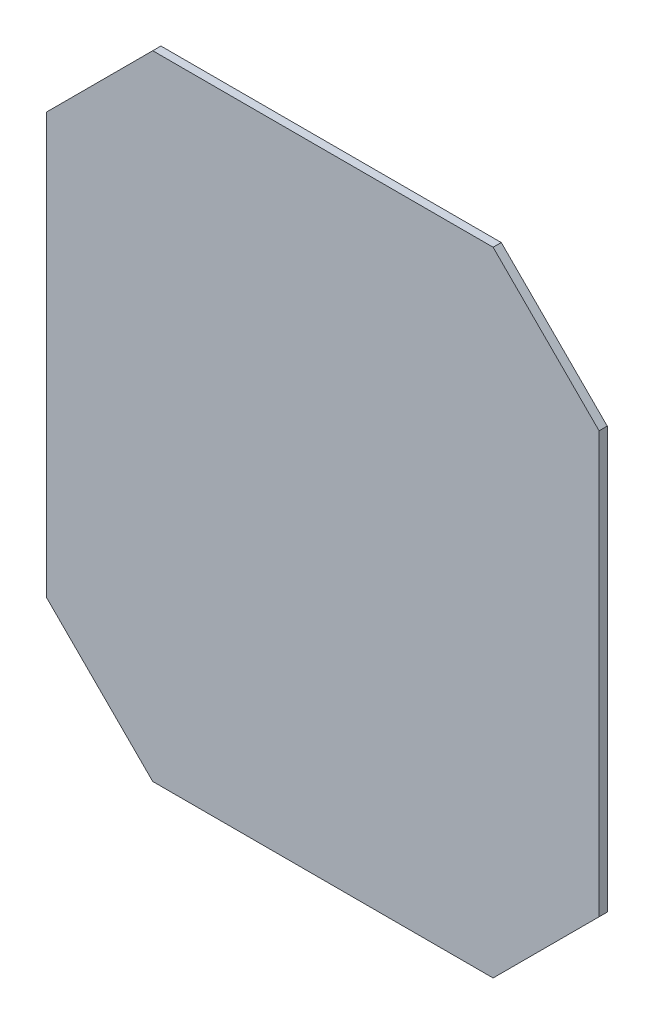
ISO-10303-21;
HEADER;
FILE_DESCRIPTION(('STEP AP214'),'2;1');
FILE_NAME('part.step','',(''),(''),'','','');
FILE_SCHEMA(('AUTOMOTIVE_DESIGN { 1 0 10303 214 1 1 1 1 }'));
ENDSEC;
DATA;
#1=APPLICATION_CONTEXT('core data for automotive mechanical design processes');
#2=APPLICATION_PROTOCOL_DEFINITION('international standard','automotive_design',2000,#1);
#3=PRODUCT_CONTEXT('',#1,'mechanical');
#4=PRODUCT('Part','Part','',(#3));
#5=PRODUCT_RELATED_PRODUCT_CATEGORY('part','',(#4));
#6=PRODUCT_DEFINITION_FORMATION('','',#4);
#7=PRODUCT_DEFINITION_CONTEXT('part definition',#1,'design');
#8=PRODUCT_DEFINITION('design','',#6,#7);
#9=PRODUCT_DEFINITION_SHAPE('','',#8);
#10=(LENGTH_UNIT() NAMED_UNIT(*) SI_UNIT(.MILLI.,.METRE.));
#11=(NAMED_UNIT(*) PLANE_ANGLE_UNIT() SI_UNIT($,.RADIAN.));
#12=(NAMED_UNIT(*) SI_UNIT($,.STERADIAN.) SOLID_ANGLE_UNIT());
#13=UNCERTAINTY_MEASURE_WITH_UNIT(LENGTH_MEASURE(1.E-05),#10,'distance_accuracy_value','');
#14=(GEOMETRIC_REPRESENTATION_CONTEXT(3) GLOBAL_UNCERTAINTY_ASSIGNED_CONTEXT((#13)) GLOBAL_UNIT_ASSIGNED_CONTEXT((#10,
#11,#12)) REPRESENTATION_CONTEXT('',''));
#15=CARTESIAN_POINT('',(0.,0.,0.));
#16=DIRECTION('',(0.,0.,1.));
#17=DIRECTION('',(1.,0.,0.));
#18=AXIS2_PLACEMENT_3D('',#15,#16,#17);
#19=CARTESIAN_POINT('',(0.,0.,4.));
#20=DIRECTION('',(0.,0.,1.));
#21=DIRECTION('',(1.,0.,0.));
#22=AXIS2_PLACEMENT_3D('',#19,#20,#21);
#23=PLANE('',#22);
#24=DIRECTION('',(0.,1.,0.));
#25=VECTOR('',#24,1.);
#26=CARTESIAN_POINT('',(135.331357884196,-264.128297397039,4.));
#27=LINE('',#26,#25);
#28=CARTESIAN_POINT('',(135.331357884196,-470.374437245392,4.));
#29=VERTEX_POINT('',#28);
#30=CARTESIAN_POINT('',(135.331357884196,-264.128297397039,4.));
#31=VERTEX_POINT('',#30);
#32=EDGE_CURVE('E132',#29,#31,#27,.T.);
#33=ORIENTED_EDGE('',*,*,#32,.T.);
#34=DIRECTION('',(-0.707106781186547,0.707106781186548,0.));
#35=VECTOR('',#34,1.);
#36=CARTESIAN_POINT('',(-64.3984697564215,-64.3984697564215,4.));
#37=LINE('',#36,#35);
#38=CARTESIAN_POINT('',(83.3944278083729,-212.191367321216,4.));
#39=VERTEX_POINT('',#38);
#40=EDGE_CURVE('E124',#31,#39,#37,.T.);
#41=ORIENTED_EDGE('',*,*,#40,.T.);
#42=DIRECTION('',(-1.,0.,0.));
#43=VECTOR('',#42,1.);
#44=CARTESIAN_POINT('',(-83.3944278083729,-212.191367321216,4.));
#45=LINE('',#44,#43);
#46=CARTESIAN_POINT('',(-83.3944278083729,-212.191367321216,4.));
#47=VERTEX_POINT('',#46);
#48=EDGE_CURVE('E119',#39,#47,#45,.T.);
#49=ORIENTED_EDGE('',*,*,#48,.T.);
#50=DIRECTION('',(0.707106781186547,0.707106781186548,0.));
#51=VECTOR('',#50,1.);
#52=CARTESIAN_POINT('',(64.3984697564215,-64.3984697564215,4.));
#53=LINE('',#52,#51);
#54=CARTESIAN_POINT('',(-135.331357884196,-264.128297397039,4.));
#55=VERTEX_POINT('',#54);
#56=EDGE_CURVE('E104',#55,#47,#53,.T.);
#57=ORIENTED_EDGE('',*,*,#56,.F.);
#58=DIRECTION('',(0.,-1.,0.));
#59=VECTOR('',#58,1.);
#60=CARTESIAN_POINT('',(-135.331357884196,-264.128297397039,4.));
#61=LINE('',#60,#59);
#62=CARTESIAN_POINT('',(-135.331357884196,-470.374437245392,4.));
#63=VERTEX_POINT('',#62);
#64=EDGE_CURVE('E125',#55,#63,#61,.T.);
#65=ORIENTED_EDGE('',*,*,#64,.T.);
#66=DIRECTION('',(0.707106781186547,-0.707106781186548,0.));
#67=VECTOR('',#66,1.);
#68=CARTESIAN_POINT('',(-302.852897564794,-302.852897564794,4.));
#69=LINE('',#68,#67);
#70=CARTESIAN_POINT('',(-83.3944278083727,-522.311367321216,4.));
#71=VERTEX_POINT('',#70);
#72=EDGE_CURVE('E113',#63,#71,#69,.T.);
#73=ORIENTED_EDGE('',*,*,#72,.T.);
#74=DIRECTION('',(1.,0.,0.));
#75=VECTOR('',#74,1.);
#76=CARTESIAN_POINT('',(-83.3944278083727,-522.311367321216,4.));
#77=LINE('',#76,#75);
#78=CARTESIAN_POINT('',(83.3944278083727,-522.311367321216,4.));
#79=VERTEX_POINT('',#78);
#80=EDGE_CURVE('E127',#71,#79,#77,.T.);
#81=ORIENTED_EDGE('',*,*,#80,.T.);
#82=DIRECTION('',(-0.707106781186547,-0.707106781186548,0.));
#83=VECTOR('',#82,1.);
#84=CARTESIAN_POINT('',(302.852897564794,-302.852897564794,4.));
#85=LINE('',#84,#83);
#86=EDGE_CURVE('E153',#29,#79,#85,.T.);
#87=ORIENTED_EDGE('',*,*,#86,.F.);
#88=EDGE_LOOP('',(#33,#41,#49,#57,#65,#73,#81,#87));
#89=FACE_BOUND('',#88,.T.);
#90=ADVANCED_FACE('F39',(#89),#23,.T.);
#91=CARTESIAN_POINT('',(0.,0.,0.));
#92=DIRECTION('',(0.,0.,1.));
#93=DIRECTION('',(1.,0.,0.));
#94=AXIS2_PLACEMENT_3D('',#91,#92,#93);
#95=PLANE('',#94);
#96=DIRECTION('',(-0.707106781186547,0.707106781186548,0.));
#97=VECTOR('',#96,1.);
#98=CARTESIAN_POINT('',(-64.3984697564215,-64.3984697564215,0.));
#99=LINE('',#98,#97);
#100=CARTESIAN_POINT('',(135.331357884196,-264.128297397039,0.));
#101=VERTEX_POINT('',#100);
#102=CARTESIAN_POINT('',(83.3944278083729,-212.191367321216,0.));
#103=VERTEX_POINT('',#102);
#104=EDGE_CURVE('E54',#101,#103,#99,.T.);
#105=ORIENTED_EDGE('',*,*,#104,.F.);
#106=DIRECTION('',(0.,1.,0.));
#107=VECTOR('',#106,1.);
#108=CARTESIAN_POINT('',(135.331357884196,0.,0.));
#109=LINE('',#108,#107);
#110=CARTESIAN_POINT('',(135.331357884196,-470.374437245392,0.));
#111=VERTEX_POINT('',#110);
#112=EDGE_CURVE('E11',#111,#101,#109,.T.);
#113=ORIENTED_EDGE('',*,*,#112,.F.);
#114=DIRECTION('',(-0.707106781186547,-0.707106781186548,0.));
#115=VECTOR('',#114,1.);
#116=CARTESIAN_POINT('',(302.852897564794,-302.852897564794,0.));
#117=LINE('',#116,#115);
#118=CARTESIAN_POINT('',(83.3944278083727,-522.311367321216,0.));
#119=VERTEX_POINT('',#118);
#120=EDGE_CURVE('E159',#111,#119,#117,.T.);
#121=ORIENTED_EDGE('',*,*,#120,.T.);
#122=DIRECTION('',(1.,0.,0.));
#123=VECTOR('',#122,1.);
#124=CARTESIAN_POINT('',(0.,-522.311367321216,0.));
#125=LINE('',#124,#123);
#126=CARTESIAN_POINT('',(-83.3944278083727,-522.311367321216,0.));
#127=VERTEX_POINT('',#126);
#128=EDGE_CURVE('E47',#127,#119,#125,.T.);
#129=ORIENTED_EDGE('',*,*,#128,.F.);
#130=DIRECTION('',(0.707106781186547,-0.707106781186548,0.));
#131=VECTOR('',#130,1.);
#132=CARTESIAN_POINT('',(-302.852897564794,-302.852897564794,0.));
#133=LINE('',#132,#131);
#134=CARTESIAN_POINT('',(-135.331357884196,-470.374437245392,0.));
#135=VERTEX_POINT('',#134);
#136=EDGE_CURVE('E157',#135,#127,#133,.T.);
#137=ORIENTED_EDGE('',*,*,#136,.F.);
#138=DIRECTION('',(0.,-1.,0.));
#139=VECTOR('',#138,1.);
#140=CARTESIAN_POINT('',(-135.331357884196,0.,0.));
#141=LINE('',#140,#139);
#142=CARTESIAN_POINT('',(-135.331357884196,-264.128297397039,0.));
#143=VERTEX_POINT('',#142);
#144=EDGE_CURVE('E163',#143,#135,#141,.T.);
#145=ORIENTED_EDGE('',*,*,#144,.F.);
#146=DIRECTION('',(0.707106781186547,0.707106781186548,0.));
#147=VECTOR('',#146,1.);
#148=CARTESIAN_POINT('',(64.3984697564215,-64.3984697564215,0.));
#149=LINE('',#148,#147);
#150=CARTESIAN_POINT('',(-83.3944278083729,-212.191367321216,0.));
#151=VERTEX_POINT('',#150);
#152=EDGE_CURVE('E137',#143,#151,#149,.T.);
#153=ORIENTED_EDGE('',*,*,#152,.T.);
#154=DIRECTION('',(-1.,0.,0.));
#155=VECTOR('',#154,1.);
#156=CARTESIAN_POINT('',(0.,-212.191367321216,0.));
#157=LINE('',#156,#155);
#158=EDGE_CURVE('E120',#103,#151,#157,.T.);
#159=ORIENTED_EDGE('',*,*,#158,.F.);
#160=EDGE_LOOP('',(#105,#113,#121,#129,#137,#145,#153,#159));
#161=FACE_BOUND('',#160,.T.);
#162=ADVANCED_FACE('F180',(#161),#95,.F.);
#163=CARTESIAN_POINT('',(64.3984697564215,-64.3984697564215,4.));
#164=DIRECTION('',(-0.707106781186548,0.707106781186547,0.));
#165=DIRECTION('',(-0.707106781186547,-0.707106781186548,0.));
#166=AXIS2_PLACEMENT_3D('',#163,#164,#165);
#167=PLANE('',#166);
#168=ORIENTED_EDGE('',*,*,#152,.F.);
#169=DIRECTION('',(0.,0.,1.));
#170=VECTOR('',#169,1.);
#171=CARTESIAN_POINT('',(-135.331357884196,-264.128297397039,-6.));
#172=LINE('',#171,#170);
#173=EDGE_CURVE('E108',#143,#55,#172,.T.);
#174=ORIENTED_EDGE('',*,*,#173,.T.);
#175=ORIENTED_EDGE('',*,*,#56,.T.);
#176=DIRECTION('',(0.,0.,1.));
#177=VECTOR('',#176,1.);
#178=CARTESIAN_POINT('',(-83.3944278083729,-212.191367321216,-6.));
#179=LINE('',#178,#177);
#180=EDGE_CURVE('E106',#151,#47,#179,.T.);
#181=ORIENTED_EDGE('',*,*,#180,.F.);
#182=EDGE_LOOP('',(#168,#174,#175,#181));
#183=FACE_BOUND('',#182,.T.);
#184=ADVANCED_FACE('F41',(#183),#167,.T.);
#185=CARTESIAN_POINT('',(-302.852897564794,-302.852897564794,4.));
#186=DIRECTION('',(0.707106781186548,0.707106781186547,0.));
#187=DIRECTION('',(-0.707106781186547,0.707106781186548,0.));
#188=AXIS2_PLACEMENT_3D('',#185,#186,#187);
#189=PLANE('',#188);
#190=ORIENTED_EDGE('',*,*,#136,.T.);
#191=DIRECTION('',(0.,0.,1.));
#192=VECTOR('',#191,1.);
#193=CARTESIAN_POINT('',(-83.3944278083727,-522.311367321216,-6.));
#194=LINE('',#193,#192);
#195=EDGE_CURVE('E144',#127,#71,#194,.T.);
#196=ORIENTED_EDGE('',*,*,#195,.T.);
#197=ORIENTED_EDGE('',*,*,#72,.F.);
#198=DIRECTION('',(0.,0.,1.));
#199=VECTOR('',#198,1.);
#200=CARTESIAN_POINT('',(-135.331357884196,-470.374437245392,-6.));
#201=LINE('',#200,#199);
#202=EDGE_CURVE('E147',#135,#63,#201,.T.);
#203=ORIENTED_EDGE('',*,*,#202,.F.);
#204=EDGE_LOOP('',(#190,#196,#197,#203));
#205=FACE_BOUND('',#204,.T.);
#206=ADVANCED_FACE('F178',(#205),#189,.F.);
#207=CARTESIAN_POINT('',(302.852897564794,-302.852897564794,4.));
#208=DIRECTION('',(0.707106781186548,-0.707106781186547,0.));
#209=DIRECTION('',(0.707106781186547,0.707106781186548,0.));
#210=AXIS2_PLACEMENT_3D('',#207,#208,#209);
#211=PLANE('',#210);
#212=ORIENTED_EDGE('',*,*,#120,.F.);
#213=DIRECTION('',(0.,0.,1.));
#214=VECTOR('',#213,1.);
#215=CARTESIAN_POINT('',(135.331357884196,-470.374437245392,-6.));
#216=LINE('',#215,#214);
#217=EDGE_CURVE('E138',#111,#29,#216,.T.);
#218=ORIENTED_EDGE('',*,*,#217,.T.);
#219=ORIENTED_EDGE('',*,*,#86,.T.);
#220=DIRECTION('',(0.,0.,1.));
#221=VECTOR('',#220,1.);
#222=CARTESIAN_POINT('',(83.3944278083727,-522.311367321216,-6.));
#223=LINE('',#222,#221);
#224=EDGE_CURVE('E141',#119,#79,#223,.T.);
#225=ORIENTED_EDGE('',*,*,#224,.F.);
#226=EDGE_LOOP('',(#212,#218,#219,#225));
#227=FACE_BOUND('',#226,.T.);
#228=ADVANCED_FACE('F173',(#227),#211,.T.);
#229=CARTESIAN_POINT('',(-64.3984697564215,-64.3984697564215,4.));
#230=DIRECTION('',(-0.707106781186548,-0.707106781186547,0.));
#231=DIRECTION('',(0.707106781186547,-0.707106781186548,0.));
#232=AXIS2_PLACEMENT_3D('',#229,#230,#231);
#233=PLANE('',#232);
#234=ORIENTED_EDGE('',*,*,#104,.T.);
#235=DIRECTION('',(0.,0.,1.));
#236=VECTOR('',#235,1.);
#237=CARTESIAN_POINT('',(83.3944278083729,-212.191367321216,-6.));
#238=LINE('',#237,#236);
#239=EDGE_CURVE('E121',#103,#39,#238,.T.);
#240=ORIENTED_EDGE('',*,*,#239,.T.);
#241=ORIENTED_EDGE('',*,*,#40,.F.);
#242=DIRECTION('',(0.,0.,1.));
#243=VECTOR('',#242,1.);
#244=CARTESIAN_POINT('',(135.331357884196,-264.128297397039,-6.));
#245=LINE('',#244,#243);
#246=EDGE_CURVE('E134',#101,#31,#245,.T.);
#247=ORIENTED_EDGE('',*,*,#246,.F.);
#248=EDGE_LOOP('',(#234,#240,#241,#247));
#249=FACE_BOUND('',#248,.T.);
#250=ADVANCED_FACE('F191',(#249),#233,.F.);
#251=CARTESIAN_POINT('',(-83.3944278083729,-212.191367321216,-6.));
#252=DIRECTION('',(0.,1.,0.));
#253=DIRECTION('',(0.,0.,1.));
#254=AXIS2_PLACEMENT_3D('',#251,#252,#253);
#255=PLANE('',#254);
#256=ORIENTED_EDGE('',*,*,#158,.T.);
#257=ORIENTED_EDGE('',*,*,#180,.T.);
#258=ORIENTED_EDGE('',*,*,#48,.F.);
#259=ORIENTED_EDGE('',*,*,#239,.F.);
#260=EDGE_LOOP('',(#256,#257,#258,#259));
#261=FACE_BOUND('',#260,.T.);
#262=ADVANCED_FACE('F118',(#261),#255,.T.);
#263=CARTESIAN_POINT('',(-135.331357884196,-264.128297397039,-6.));
#264=DIRECTION('',(-1.,0.,0.));
#265=DIRECTION('',(0.,-1.,0.));
#266=AXIS2_PLACEMENT_3D('',#263,#264,#265);
#267=PLANE('',#266);
#268=ORIENTED_EDGE('',*,*,#144,.T.);
#269=ORIENTED_EDGE('',*,*,#202,.T.);
#270=ORIENTED_EDGE('',*,*,#64,.F.);
#271=ORIENTED_EDGE('',*,*,#173,.F.);
#272=EDGE_LOOP('',(#268,#269,#270,#271));
#273=FACE_BOUND('',#272,.T.);
#274=ADVANCED_FACE('F182',(#273),#267,.T.);
#275=CARTESIAN_POINT('',(-83.3944278083727,-522.311367321216,-6.));
#276=DIRECTION('',(0.,-1.,0.));
#277=DIRECTION('',(0.,0.,-1.));
#278=AXIS2_PLACEMENT_3D('',#275,#276,#277);
#279=PLANE('',#278);
#280=ORIENTED_EDGE('',*,*,#128,.T.);
#281=ORIENTED_EDGE('',*,*,#224,.T.);
#282=ORIENTED_EDGE('',*,*,#80,.F.);
#283=ORIENTED_EDGE('',*,*,#195,.F.);
#284=EDGE_LOOP('',(#280,#281,#282,#283));
#285=FACE_BOUND('',#284,.T.);
#286=ADVANCED_FACE('F170',(#285),#279,.T.);
#287=CARTESIAN_POINT('',(135.331357884196,-264.128297397039,-6.));
#288=DIRECTION('',(1.,0.,0.));
#289=DIRECTION('',(0.,0.,-1.));
#290=AXIS2_PLACEMENT_3D('',#287,#288,#289);
#291=PLANE('',#290);
#292=ORIENTED_EDGE('',*,*,#112,.T.);
#293=ORIENTED_EDGE('',*,*,#246,.T.);
#294=ORIENTED_EDGE('',*,*,#32,.F.);
#295=ORIENTED_EDGE('',*,*,#217,.F.);
#296=EDGE_LOOP('',(#292,#293,#294,#295));
#297=FACE_BOUND('',#296,.T.);
#298=ADVANCED_FACE('F189',(#297),#291,.T.);
#299=CLOSED_SHELL('',(#90,#162,#184,#206,#228,#250,#262,#274,#286,#298));
#300=MANIFOLD_SOLID_BREP('B2',#299);
#301=ADVANCED_BREP_SHAPE_REPRESENTATION('',(#18,#300),#14);
#302=SHAPE_DEFINITION_REPRESENTATION(#9,#301);
ENDSEC;
END-ISO-10303-21;
